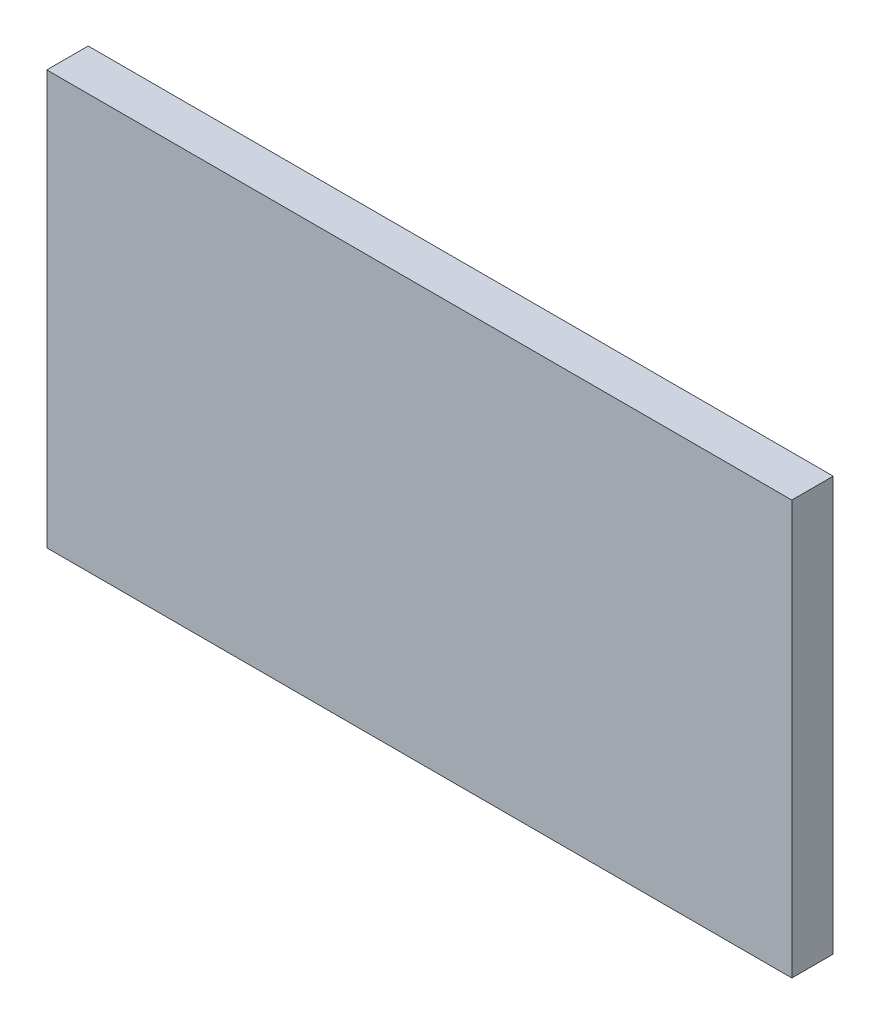
ISO-10303-21;
HEADER;
FILE_DESCRIPTION(('STEP AP214'),'2;1');
FILE_NAME('part.step','',(''),(''),'','','');
FILE_SCHEMA(('AUTOMOTIVE_DESIGN { 1 0 10303 214 1 1 1 1 }'));
ENDSEC;
DATA;
#1=APPLICATION_CONTEXT('core data for automotive mechanical design processes');
#2=APPLICATION_PROTOCOL_DEFINITION('international standard','automotive_design',2000,#1);
#3=PRODUCT_CONTEXT('',#1,'mechanical');
#4=PRODUCT('Part','Part','',(#3));
#5=PRODUCT_RELATED_PRODUCT_CATEGORY('part','',(#4));
#6=PRODUCT_DEFINITION_FORMATION('','',#4);
#7=PRODUCT_DEFINITION_CONTEXT('part definition',#1,'design');
#8=PRODUCT_DEFINITION('design','',#6,#7);
#9=PRODUCT_DEFINITION_SHAPE('','',#8);
#10=(LENGTH_UNIT() NAMED_UNIT(*) SI_UNIT(.MILLI.,.METRE.));
#11=(NAMED_UNIT(*) PLANE_ANGLE_UNIT() SI_UNIT($,.RADIAN.));
#12=(NAMED_UNIT(*) SI_UNIT($,.STERADIAN.) SOLID_ANGLE_UNIT());
#13=UNCERTAINTY_MEASURE_WITH_UNIT(LENGTH_MEASURE(1.E-05),#10,'distance_accuracy_value','');
#14=(GEOMETRIC_REPRESENTATION_CONTEXT(3) GLOBAL_UNCERTAINTY_ASSIGNED_CONTEXT((#13)) GLOBAL_UNIT_ASSIGNED_CONTEXT((#10,
#11,#12)) REPRESENTATION_CONTEXT('',''));
#15=CARTESIAN_POINT('',(0.,0.,0.));
#16=DIRECTION('',(0.,0.,1.));
#17=DIRECTION('',(1.,0.,0.));
#18=AXIS2_PLACEMENT_3D('',#15,#16,#17);
#19=CARTESIAN_POINT('',(57.15,31.75,6.35));
#20=DIRECTION('',(-1.,0.,0.));
#21=DIRECTION('',(0.,-1.,0.));
#22=AXIS2_PLACEMENT_3D('',#19,#20,#21);
#23=PLANE('',#22);
#24=DIRECTION('',(0.,1.,0.));
#25=VECTOR('',#24,1.);
#26=CARTESIAN_POINT('',(57.15,31.75,0.));
#27=LINE('',#26,#25);
#28=CARTESIAN_POINT('',(57.15,-31.75,0.));
#29=VERTEX_POINT('',#28);
#30=CARTESIAN_POINT('',(57.15,31.75,0.));
#31=VERTEX_POINT('',#30);
#32=EDGE_CURVE('E96',#29,#31,#27,.T.);
#33=ORIENTED_EDGE('',*,*,#32,.T.);
#34=DIRECTION('',(0.,0.,-1.));
#35=VECTOR('',#34,1.);
#36=CARTESIAN_POINT('',(57.15,31.75,6.35));
#37=LINE('',#36,#35);
#38=CARTESIAN_POINT('',(57.15,31.75,6.35));
#39=VERTEX_POINT('',#38);
#40=EDGE_CURVE('E11',#39,#31,#37,.T.);
#41=ORIENTED_EDGE('',*,*,#40,.F.);
#42=DIRECTION('',(0.,1.,0.));
#43=VECTOR('',#42,1.);
#44=CARTESIAN_POINT('',(57.15,31.75,6.35));
#45=LINE('',#44,#43);
#46=CARTESIAN_POINT('',(57.15,-31.75,6.35));
#47=VERTEX_POINT('',#46);
#48=EDGE_CURVE('E84',#47,#39,#45,.T.);
#49=ORIENTED_EDGE('',*,*,#48,.F.);
#50=DIRECTION('',(0.,0.,-1.));
#51=VECTOR('',#50,1.);
#52=CARTESIAN_POINT('',(57.15,-31.75,6.35));
#53=LINE('',#52,#51);
#54=EDGE_CURVE('E92',#47,#29,#53,.T.);
#55=ORIENTED_EDGE('',*,*,#54,.T.);
#56=EDGE_LOOP('',(#33,#41,#49,#55));
#57=FACE_BOUND('',#56,.T.);
#58=ADVANCED_FACE('F33',(#57),#23,.F.);
#59=CARTESIAN_POINT('',(-57.15,31.75,6.35));
#60=DIRECTION('',(0.,-1.,0.));
#61=DIRECTION('',(0.,0.,-1.));
#62=AXIS2_PLACEMENT_3D('',#59,#60,#61);
#63=PLANE('',#62);
#64=DIRECTION('',(-1.,0.,0.));
#65=VECTOR('',#64,1.);
#66=CARTESIAN_POINT('',(-57.15,31.75,0.));
#67=LINE('',#66,#65);
#68=CARTESIAN_POINT('',(-57.15,31.75,0.));
#69=VERTEX_POINT('',#68);
#70=EDGE_CURVE('E88',#31,#69,#67,.T.);
#71=ORIENTED_EDGE('',*,*,#70,.T.);
#72=DIRECTION('',(0.,0.,-1.));
#73=VECTOR('',#72,1.);
#74=CARTESIAN_POINT('',(-57.15,31.75,6.35));
#75=LINE('',#74,#73);
#76=CARTESIAN_POINT('',(-57.15,31.75,6.35));
#77=VERTEX_POINT('',#76);
#78=EDGE_CURVE('E41',#77,#69,#75,.T.);
#79=ORIENTED_EDGE('',*,*,#78,.F.);
#80=DIRECTION('',(-1.,0.,0.));
#81=VECTOR('',#80,1.);
#82=CARTESIAN_POINT('',(-57.15,31.75,6.35));
#83=LINE('',#82,#81);
#84=EDGE_CURVE('E79',#39,#77,#83,.T.);
#85=ORIENTED_EDGE('',*,*,#84,.F.);
#86=ORIENTED_EDGE('',*,*,#40,.T.);
#87=EDGE_LOOP('',(#71,#79,#85,#86));
#88=FACE_BOUND('',#87,.T.);
#89=ADVANCED_FACE('F87',(#88),#63,.F.);
#90=CARTESIAN_POINT('',(-57.15,31.75,6.35));
#91=DIRECTION('',(1.,0.,0.));
#92=DIRECTION('',(0.,1.,0.));
#93=AXIS2_PLACEMENT_3D('',#90,#91,#92);
#94=PLANE('',#93);
#95=DIRECTION('',(0.,-1.,0.));
#96=VECTOR('',#95,1.);
#97=CARTESIAN_POINT('',(-57.15,31.75,0.));
#98=LINE('',#97,#96);
#99=CARTESIAN_POINT('',(-57.15,-31.75,0.));
#100=VERTEX_POINT('',#99);
#101=EDGE_CURVE('E66',#69,#100,#98,.T.);
#102=ORIENTED_EDGE('',*,*,#101,.T.);
#103=DIRECTION('',(0.,0.,-1.));
#104=VECTOR('',#103,1.);
#105=CARTESIAN_POINT('',(-57.15,-31.75,6.35));
#106=LINE('',#105,#104);
#107=CARTESIAN_POINT('',(-57.15,-31.75,6.35));
#108=VERTEX_POINT('',#107);
#109=EDGE_CURVE('E89',#108,#100,#106,.T.);
#110=ORIENTED_EDGE('',*,*,#109,.F.);
#111=DIRECTION('',(0.,-1.,0.));
#112=VECTOR('',#111,1.);
#113=CARTESIAN_POINT('',(-57.15,31.75,6.35));
#114=LINE('',#113,#112);
#115=EDGE_CURVE('E82',#77,#108,#114,.T.);
#116=ORIENTED_EDGE('',*,*,#115,.F.);
#117=ORIENTED_EDGE('',*,*,#78,.T.);
#118=EDGE_LOOP('',(#102,#110,#116,#117));
#119=FACE_BOUND('',#118,.T.);
#120=ADVANCED_FACE('F90',(#119),#94,.F.);
#121=CARTESIAN_POINT('',(-57.15,-31.75,6.35));
#122=DIRECTION('',(0.,1.,0.));
#123=DIRECTION('',(0.,0.,1.));
#124=AXIS2_PLACEMENT_3D('',#121,#122,#123);
#125=PLANE('',#124);
#126=DIRECTION('',(1.,0.,0.));
#127=VECTOR('',#126,1.);
#128=CARTESIAN_POINT('',(-57.15,-31.75,0.));
#129=LINE('',#128,#127);
#130=EDGE_CURVE('E72',#100,#29,#129,.T.);
#131=ORIENTED_EDGE('',*,*,#130,.T.);
#132=ORIENTED_EDGE('',*,*,#54,.F.);
#133=DIRECTION('',(1.,0.,0.));
#134=VECTOR('',#133,1.);
#135=CARTESIAN_POINT('',(-57.15,-31.75,6.35));
#136=LINE('',#135,#134);
#137=EDGE_CURVE('E49',#108,#47,#136,.T.);
#138=ORIENTED_EDGE('',*,*,#137,.F.);
#139=ORIENTED_EDGE('',*,*,#109,.T.);
#140=EDGE_LOOP('',(#131,#132,#138,#139));
#141=FACE_BOUND('',#140,.T.);
#142=ADVANCED_FACE('F103',(#141),#125,.F.);
#143=CARTESIAN_POINT('',(0.,0.,6.35));
#144=DIRECTION('',(0.,0.,1.));
#145=DIRECTION('',(1.,0.,0.));
#146=AXIS2_PLACEMENT_3D('',#143,#144,#145);
#147=PLANE('',#146);
#148=ORIENTED_EDGE('',*,*,#48,.T.);
#149=ORIENTED_EDGE('',*,*,#84,.T.);
#150=ORIENTED_EDGE('',*,*,#115,.T.);
#151=ORIENTED_EDGE('',*,*,#137,.T.);
#152=EDGE_LOOP('',(#148,#149,#150,#151));
#153=FACE_BOUND('',#152,.T.);
#154=ADVANCED_FACE('F80',(#153),#147,.T.);
#155=CARTESIAN_POINT('',(0.,0.,0.));
#156=DIRECTION('',(0.,0.,1.));
#157=DIRECTION('',(1.,0.,0.));
#158=AXIS2_PLACEMENT_3D('',#155,#156,#157);
#159=PLANE('',#158);
#160=ORIENTED_EDGE('',*,*,#32,.F.);
#161=ORIENTED_EDGE('',*,*,#130,.F.);
#162=ORIENTED_EDGE('',*,*,#101,.F.);
#163=ORIENTED_EDGE('',*,*,#70,.F.);
#164=EDGE_LOOP('',(#160,#161,#162,#163));
#165=FACE_BOUND('',#164,.T.);
#166=ADVANCED_FACE('F106',(#165),#159,.F.);
#167=CLOSED_SHELL('',(#58,#89,#120,#142,#154,#166));
#168=MANIFOLD_SOLID_BREP('B2',#167);
#169=ADVANCED_BREP_SHAPE_REPRESENTATION('',(#18,#168),#14);
#170=SHAPE_DEFINITION_REPRESENTATION(#9,#169);
ENDSEC;
END-ISO-10303-21;
